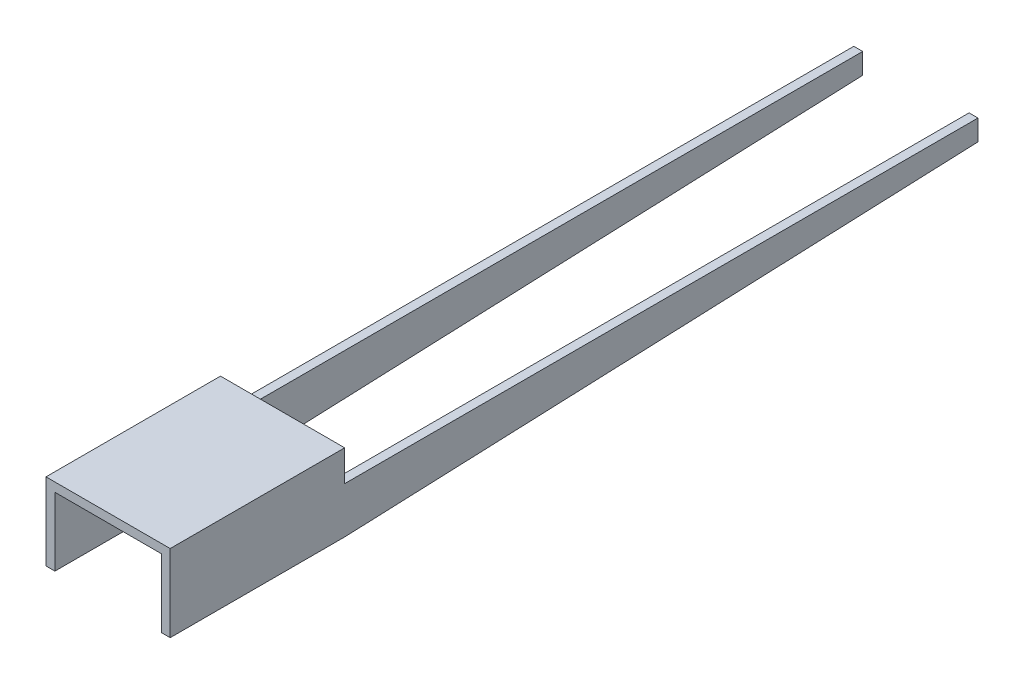
ISO-10303-21;
HEADER;
FILE_DESCRIPTION(('STEP AP214'),'2;1');
FILE_NAME('part.step','',(''),(''),'','','');
FILE_SCHEMA(('AUTOMOTIVE_DESIGN { 1 0 10303 214 1 1 1 1 }'));
ENDSEC;
DATA;
#1=APPLICATION_CONTEXT('core data for automotive mechanical design processes');
#2=APPLICATION_PROTOCOL_DEFINITION('international standard','automotive_design',2000,#1);
#3=PRODUCT_CONTEXT('',#1,'mechanical');
#4=PRODUCT('Part','Part','',(#3));
#5=PRODUCT_RELATED_PRODUCT_CATEGORY('part','',(#4));
#6=PRODUCT_DEFINITION_FORMATION('','',#4);
#7=PRODUCT_DEFINITION_CONTEXT('part definition',#1,'design');
#8=PRODUCT_DEFINITION('design','',#6,#7);
#9=PRODUCT_DEFINITION_SHAPE('','',#8);
#10=(LENGTH_UNIT() NAMED_UNIT(*) SI_UNIT(.MILLI.,.METRE.));
#11=(NAMED_UNIT(*) PLANE_ANGLE_UNIT() SI_UNIT($,.RADIAN.));
#12=(NAMED_UNIT(*) SI_UNIT($,.STERADIAN.) SOLID_ANGLE_UNIT());
#13=UNCERTAINTY_MEASURE_WITH_UNIT(LENGTH_MEASURE(1.E-05),#10,'distance_accuracy_value','');
#14=(GEOMETRIC_REPRESENTATION_CONTEXT(3) GLOBAL_UNCERTAINTY_ASSIGNED_CONTEXT((#13)) GLOBAL_UNIT_ASSIGNED_CONTEXT((#10,
#11,#12)) REPRESENTATION_CONTEXT('',''));
#15=CARTESIAN_POINT('',(0.,0.,0.));
#16=DIRECTION('',(0.,0.,1.));
#17=DIRECTION('',(1.,0.,0.));
#18=AXIS2_PLACEMENT_3D('',#15,#16,#17);
#19=CARTESIAN_POINT('',(0.,0.,0.));
#20=DIRECTION('',(0.,0.,1.));
#21=DIRECTION('',(1.,0.,0.));
#22=AXIS2_PLACEMENT_3D('',#19,#20,#21);
#23=PLANE('',#22);
#24=DIRECTION('',(-1.,0.,0.));
#25=VECTOR('',#24,1.);
#26=CARTESIAN_POINT('',(0.,10.,0.));
#27=LINE('',#26,#25);
#28=CARTESIAN_POINT('',(-25.7,10.,0.));
#29=VERTEX_POINT('',#28);
#30=CARTESIAN_POINT('',(-30.,10.,0.));
#31=VERTEX_POINT('',#30);
#32=EDGE_CURVE('E268',#29,#31,#27,.T.);
#33=ORIENTED_EDGE('',*,*,#32,.F.);
#34=DIRECTION('',(0.,1.,0.));
#35=VECTOR('',#34,1.);
#36=CARTESIAN_POINT('',(-25.7,0.,0.));
#37=LINE('',#36,#35);
#38=CARTESIAN_POINT('',(-25.7,0.,0.));
#39=VERTEX_POINT('',#38);
#40=EDGE_CURVE('E251',#39,#29,#37,.T.);
#41=ORIENTED_EDGE('',*,*,#40,.F.);
#42=DIRECTION('',(1.,0.,0.));
#43=VECTOR('',#42,1.);
#44=CARTESIAN_POINT('',(-30.,0.,0.));
#45=LINE('',#44,#43);
#46=CARTESIAN_POINT('',(-30.,0.,0.));
#47=VERTEX_POINT('',#46);
#48=EDGE_CURVE('E248',#47,#39,#45,.T.);
#49=ORIENTED_EDGE('',*,*,#48,.F.);
#50=DIRECTION('',(0.,-1.,0.));
#51=VECTOR('',#50,1.);
#52=CARTESIAN_POINT('',(-30.,25.,0.));
#53=LINE('',#52,#51);
#54=EDGE_CURVE('E239',#31,#47,#53,.T.);
#55=ORIENTED_EDGE('',*,*,#54,.F.);
#56=EDGE_LOOP('',(#33,#41,#49,#55));
#57=FACE_BOUND('',#56,.T.);
#58=ADVANCED_FACE('F43',(#57),#23,.F.);
#59=DIRECTION('',(-1.,0.,0.));
#60=VECTOR('',#59,1.);
#61=CARTESIAN_POINT('',(0.,10.,0.));
#62=LINE('',#61,#60);
#63=CARTESIAN_POINT('',(30.,10.,0.));
#64=VERTEX_POINT('',#63);
#65=CARTESIAN_POINT('',(25.7,10.,0.));
#66=VERTEX_POINT('',#65);
#67=EDGE_CURVE('E11',#64,#66,#62,.T.);
#68=ORIENTED_EDGE('',*,*,#67,.F.);
#69=DIRECTION('',(0.,1.,0.));
#70=VECTOR('',#69,1.);
#71=CARTESIAN_POINT('',(30.,0.,0.));
#72=LINE('',#71,#70);
#73=CARTESIAN_POINT('',(30.,0.,0.));
#74=VERTEX_POINT('',#73);
#75=EDGE_CURVE('E183',#74,#64,#72,.T.);
#76=ORIENTED_EDGE('',*,*,#75,.F.);
#77=DIRECTION('',(1.,0.,0.));
#78=VECTOR('',#77,1.);
#79=CARTESIAN_POINT('',(25.7,0.,0.));
#80=LINE('',#79,#78);
#81=CARTESIAN_POINT('',(25.7,0.,0.));
#82=VERTEX_POINT('',#81);
#83=EDGE_CURVE('E253',#82,#74,#80,.T.);
#84=ORIENTED_EDGE('',*,*,#83,.F.);
#85=DIRECTION('',(0.,-1.,0.));
#86=VECTOR('',#85,1.);
#87=CARTESIAN_POINT('',(25.7,20.7,0.));
#88=LINE('',#87,#86);
#89=EDGE_CURVE('E82',#66,#82,#88,.T.);
#90=ORIENTED_EDGE('',*,*,#89,.F.);
#91=EDGE_LOOP('',(#68,#76,#84,#90));
#92=FACE_BOUND('',#91,.T.);
#93=ADVANCED_FACE('F261',(#92),#23,.F.);
#94=CARTESIAN_POINT('',(-30.,25.,390.3));
#95=DIRECTION('',(1.,0.,0.));
#96=DIRECTION('',(0.,0.,-1.));
#97=AXIS2_PLACEMENT_3D('',#94,#95,#96);
#98=PLANE('',#97);
#99=DIRECTION('',(0.,0.,-1.));
#100=VECTOR('',#99,1.);
#101=CARTESIAN_POINT('',(-30.,25.,390.3));
#102=LINE('',#101,#100);
#103=CARTESIAN_POINT('',(-30.,25.,390.3));
#104=VERTEX_POINT('',#103);
#105=CARTESIAN_POINT('',(-30.,25.,306.));
#106=VERTEX_POINT('',#105);
#107=EDGE_CURVE('E169',#104,#106,#102,.T.);
#108=ORIENTED_EDGE('',*,*,#107,.T.);
#109=DIRECTION('',(0.,-1.,0.));
#110=VECTOR('',#109,1.);
#111=CARTESIAN_POINT('',(-30.,25.,306.));
#112=LINE('',#111,#110);
#113=CARTESIAN_POINT('',(-30.,10.,306.));
#114=VERTEX_POINT('',#113);
#115=EDGE_CURVE('E153',#106,#114,#112,.T.);
#116=ORIENTED_EDGE('',*,*,#115,.T.);
#117=DIRECTION('',(0.,0.,1.));
#118=VECTOR('',#117,1.);
#119=CARTESIAN_POINT('',(-30.,10.,390.3));
#120=LINE('',#119,#118);
#121=EDGE_CURVE('E273',#31,#114,#120,.T.);
#122=ORIENTED_EDGE('',*,*,#121,.F.);
#123=ORIENTED_EDGE('',*,*,#54,.T.);
#124=DIRECTION('',(0.,0.040196245461984,-0.999191804335264));
#125=VECTOR('',#124,1.);
#126=CARTESIAN_POINT('',(-30.,-12.31,306.));
#127=LINE('',#126,#125);
#128=CARTESIAN_POINT('',(-30.,-12.31,306.));
#129=VERTEX_POINT('',#128);
#130=EDGE_CURVE('E210',#129,#47,#127,.T.);
#131=ORIENTED_EDGE('',*,*,#130,.F.);
#132=DIRECTION('',(0.,0.,-1.));
#133=VECTOR('',#132,1.);
#134=CARTESIAN_POINT('',(-30.,-12.31,390.3));
#135=LINE('',#134,#133);
#136=CARTESIAN_POINT('',(-30.,-12.31,390.3));
#137=VERTEX_POINT('',#136);
#138=EDGE_CURVE('E163',#137,#129,#135,.T.);
#139=ORIENTED_EDGE('',*,*,#138,.F.);
#140=DIRECTION('',(0.,-1.,0.));
#141=VECTOR('',#140,1.);
#142=CARTESIAN_POINT('',(-30.,25.,390.3));
#143=LINE('',#142,#141);
#144=EDGE_CURVE('E176',#104,#137,#143,.T.);
#145=ORIENTED_EDGE('',*,*,#144,.F.);
#146=EDGE_LOOP('',(#108,#116,#122,#123,#131,#139,#145));
#147=FACE_BOUND('',#146,.T.);
#148=ADVANCED_FACE('F45',(#147),#98,.F.);
#149=CARTESIAN_POINT('',(-25.7,0.,390.3));
#150=DIRECTION('',(-1.,0.,0.));
#151=DIRECTION('',(0.,0.,1.));
#152=AXIS2_PLACEMENT_3D('',#149,#150,#151);
#153=PLANE('',#152);
#154=DIRECTION('',(0.,0.,-1.));
#155=VECTOR('',#154,1.);
#156=CARTESIAN_POINT('',(-25.7,10.,390.3));
#157=LINE('',#156,#155);
#158=CARTESIAN_POINT('',(-25.7,10.,306.));
#159=VERTEX_POINT('',#158);
#160=EDGE_CURVE('E201',#159,#29,#157,.T.);
#161=ORIENTED_EDGE('',*,*,#160,.F.);
#162=DIRECTION('',(0.,1.,0.));
#163=VECTOR('',#162,1.);
#164=CARTESIAN_POINT('',(-25.7,0.,306.));
#165=LINE('',#164,#163);
#166=CARTESIAN_POINT('',(-25.7,20.7,306.));
#167=VERTEX_POINT('',#166);
#168=EDGE_CURVE('E164',#159,#167,#165,.T.);
#169=ORIENTED_EDGE('',*,*,#168,.T.);
#170=DIRECTION('',(0.,0.,-1.));
#171=VECTOR('',#170,1.);
#172=CARTESIAN_POINT('',(-25.7,20.7,390.3));
#173=LINE('',#172,#171);
#174=CARTESIAN_POINT('',(-25.7,20.7,390.3));
#175=VERTEX_POINT('',#174);
#176=EDGE_CURVE('E51',#175,#167,#173,.T.);
#177=ORIENTED_EDGE('',*,*,#176,.F.);
#178=DIRECTION('',(0.,1.,0.));
#179=VECTOR('',#178,1.);
#180=CARTESIAN_POINT('',(-25.7,0.,390.3));
#181=LINE('',#180,#179);
#182=CARTESIAN_POINT('',(-25.7,-12.31,390.3));
#183=VERTEX_POINT('',#182);
#184=EDGE_CURVE('E89',#183,#175,#181,.T.);
#185=ORIENTED_EDGE('',*,*,#184,.F.);
#186=DIRECTION('',(0.,0.,-1.));
#187=VECTOR('',#186,1.);
#188=CARTESIAN_POINT('',(-25.7,-12.31,390.3));
#189=LINE('',#188,#187);
#190=CARTESIAN_POINT('',(-25.7,-12.31,306.));
#191=VERTEX_POINT('',#190);
#192=EDGE_CURVE('E207',#183,#191,#189,.T.);
#193=ORIENTED_EDGE('',*,*,#192,.T.);
#194=DIRECTION('',(0.,0.040196245461984,-0.999191804335264));
#195=VECTOR('',#194,1.);
#196=CARTESIAN_POINT('',(-25.7,-12.31,306.));
#197=LINE('',#196,#195);
#198=EDGE_CURVE('E209',#191,#39,#197,.T.);
#199=ORIENTED_EDGE('',*,*,#198,.T.);
#200=ORIENTED_EDGE('',*,*,#40,.T.);
#201=EDGE_LOOP('',(#161,#169,#177,#185,#193,#199,#200));
#202=FACE_BOUND('',#201,.T.);
#203=ADVANCED_FACE('F198',(#202),#153,.F.);
#204=CARTESIAN_POINT('',(-25.7,20.7,390.3));
#205=DIRECTION('',(0.,1.,0.));
#206=DIRECTION('',(0.,0.,1.));
#207=AXIS2_PLACEMENT_3D('',#204,#205,#206);
#208=PLANE('',#207);
#209=ORIENTED_EDGE('',*,*,#176,.T.);
#210=DIRECTION('',(1.,0.,0.));
#211=VECTOR('',#210,1.);
#212=CARTESIAN_POINT('',(-25.7,20.7,306.));
#213=LINE('',#212,#211);
#214=CARTESIAN_POINT('',(25.7,20.7,306.));
#215=VERTEX_POINT('',#214);
#216=EDGE_CURVE('E193',#167,#215,#213,.T.);
#217=ORIENTED_EDGE('',*,*,#216,.T.);
#218=DIRECTION('',(0.,0.,-1.));
#219=VECTOR('',#218,1.);
#220=CARTESIAN_POINT('',(25.7,20.7,390.3));
#221=LINE('',#220,#219);
#222=CARTESIAN_POINT('',(25.7,20.7,390.3));
#223=VERTEX_POINT('',#222);
#224=EDGE_CURVE('E178',#223,#215,#221,.T.);
#225=ORIENTED_EDGE('',*,*,#224,.F.);
#226=DIRECTION('',(1.,0.,0.));
#227=VECTOR('',#226,1.);
#228=CARTESIAN_POINT('',(-25.7,20.7,390.3));
#229=LINE('',#228,#227);
#230=EDGE_CURVE('E194',#175,#223,#229,.T.);
#231=ORIENTED_EDGE('',*,*,#230,.F.);
#232=EDGE_LOOP('',(#209,#217,#225,#231));
#233=FACE_BOUND('',#232,.T.);
#234=ADVANCED_FACE('F191',(#233),#208,.F.);
#235=CARTESIAN_POINT('',(25.7,20.7,390.3));
#236=DIRECTION('',(1.,0.,0.));
#237=DIRECTION('',(0.,0.,-1.));
#238=AXIS2_PLACEMENT_3D('',#235,#236,#237);
#239=PLANE('',#238);
#240=ORIENTED_EDGE('',*,*,#224,.T.);
#241=DIRECTION('',(0.,-1.,0.));
#242=VECTOR('',#241,1.);
#243=CARTESIAN_POINT('',(25.7,20.7,306.));
#244=LINE('',#243,#242);
#245=CARTESIAN_POINT('',(25.7,10.,306.));
#246=VERTEX_POINT('',#245);
#247=EDGE_CURVE('E203',#215,#246,#244,.T.);
#248=ORIENTED_EDGE('',*,*,#247,.T.);
#249=DIRECTION('',(0.,0.,1.));
#250=VECTOR('',#249,1.);
#251=CARTESIAN_POINT('',(25.7,10.,390.3));
#252=LINE('',#251,#250);
#253=EDGE_CURVE('E263',#66,#246,#252,.T.);
#254=ORIENTED_EDGE('',*,*,#253,.F.);
#255=ORIENTED_EDGE('',*,*,#89,.T.);
#256=DIRECTION('',(0.,0.040196245461984,-0.999191804335264));
#257=VECTOR('',#256,1.);
#258=CARTESIAN_POINT('',(25.7,-12.31,306.));
#259=LINE('',#258,#257);
#260=CARTESIAN_POINT('',(25.7,-12.31,306.));
#261=VERTEX_POINT('',#260);
#262=EDGE_CURVE('E227',#261,#82,#259,.T.);
#263=ORIENTED_EDGE('',*,*,#262,.F.);
#264=DIRECTION('',(0.,0.,-1.));
#265=VECTOR('',#264,1.);
#266=CARTESIAN_POINT('',(25.7,-12.31,390.3));
#267=LINE('',#266,#265);
#268=CARTESIAN_POINT('',(25.7,-12.31,390.3));
#269=VERTEX_POINT('',#268);
#270=EDGE_CURVE('E224',#269,#261,#267,.T.);
#271=ORIENTED_EDGE('',*,*,#270,.F.);
#272=DIRECTION('',(0.,-1.,0.));
#273=VECTOR('',#272,1.);
#274=CARTESIAN_POINT('',(25.7,20.7,390.3));
#275=LINE('',#274,#273);
#276=EDGE_CURVE('E244',#223,#269,#275,.T.);
#277=ORIENTED_EDGE('',*,*,#276,.F.);
#278=EDGE_LOOP('',(#240,#248,#254,#255,#263,#271,#277));
#279=FACE_BOUND('',#278,.T.);
#280=ADVANCED_FACE('F266',(#279),#239,.F.);
#281=CARTESIAN_POINT('',(30.,0.,390.3));
#282=DIRECTION('',(-1.,0.,0.));
#283=DIRECTION('',(0.,0.,1.));
#284=AXIS2_PLACEMENT_3D('',#281,#282,#283);
#285=PLANE('',#284);
#286=DIRECTION('',(0.,0.,-1.));
#287=VECTOR('',#286,1.);
#288=CARTESIAN_POINT('',(30.,10.,390.3));
#289=LINE('',#288,#287);
#290=CARTESIAN_POINT('',(30.,10.,306.));
#291=VERTEX_POINT('',#290);
#292=EDGE_CURVE('E57',#291,#64,#289,.T.);
#293=ORIENTED_EDGE('',*,*,#292,.F.);
#294=DIRECTION('',(0.,1.,0.));
#295=VECTOR('',#294,1.);
#296=CARTESIAN_POINT('',(30.,0.,306.));
#297=LINE('',#296,#295);
#298=CARTESIAN_POINT('',(30.,25.,306.));
#299=VERTEX_POINT('',#298);
#300=EDGE_CURVE('E275',#291,#299,#297,.T.);
#301=ORIENTED_EDGE('',*,*,#300,.T.);
#302=DIRECTION('',(0.,0.,-1.));
#303=VECTOR('',#302,1.);
#304=CARTESIAN_POINT('',(30.,25.,390.3));
#305=LINE('',#304,#303);
#306=CARTESIAN_POINT('',(30.,25.,390.3));
#307=VERTEX_POINT('',#306);
#308=EDGE_CURVE('E172',#307,#299,#305,.T.);
#309=ORIENTED_EDGE('',*,*,#308,.F.);
#310=DIRECTION('',(0.,1.,0.));
#311=VECTOR('',#310,1.);
#312=CARTESIAN_POINT('',(30.,0.,390.3));
#313=LINE('',#312,#311);
#314=CARTESIAN_POINT('',(30.,-12.31,390.3));
#315=VERTEX_POINT('',#314);
#316=EDGE_CURVE('E180',#315,#307,#313,.T.);
#317=ORIENTED_EDGE('',*,*,#316,.F.);
#318=DIRECTION('',(0.,0.,-1.));
#319=VECTOR('',#318,1.);
#320=CARTESIAN_POINT('',(30.,-12.31,390.3));
#321=LINE('',#320,#319);
#322=CARTESIAN_POINT('',(30.,-12.31,306.));
#323=VERTEX_POINT('',#322);
#324=EDGE_CURVE('E221',#315,#323,#321,.T.);
#325=ORIENTED_EDGE('',*,*,#324,.T.);
#326=DIRECTION('',(0.,0.040196245461984,-0.999191804335264));
#327=VECTOR('',#326,1.);
#328=CARTESIAN_POINT('',(30.,-12.31,306.));
#329=LINE('',#328,#327);
#330=EDGE_CURVE('E228',#323,#74,#329,.T.);
#331=ORIENTED_EDGE('',*,*,#330,.T.);
#332=ORIENTED_EDGE('',*,*,#75,.T.);
#333=EDGE_LOOP('',(#293,#301,#309,#317,#325,#331,#332));
#334=FACE_BOUND('',#333,.T.);
#335=ADVANCED_FACE('F259',(#334),#285,.F.);
#336=CARTESIAN_POINT('',(30.,25.,390.3));
#337=DIRECTION('',(0.,-1.,0.));
#338=DIRECTION('',(0.,0.,-1.));
#339=AXIS2_PLACEMENT_3D('',#336,#337,#338);
#340=PLANE('',#339);
#341=ORIENTED_EDGE('',*,*,#308,.T.);
#342=DIRECTION('',(1.,0.,0.));
#343=VECTOR('',#342,1.);
#344=CARTESIAN_POINT('',(-72.4088878130035,25.,306.));
#345=LINE('',#344,#343);
#346=EDGE_CURVE('E156',#106,#299,#345,.T.);
#347=ORIENTED_EDGE('',*,*,#346,.F.);
#348=ORIENTED_EDGE('',*,*,#107,.F.);
#349=DIRECTION('',(-1.,0.,0.));
#350=VECTOR('',#349,1.);
#351=CARTESIAN_POINT('',(30.,25.,390.3));
#352=LINE('',#351,#350);
#353=EDGE_CURVE('E66',#307,#104,#352,.T.);
#354=ORIENTED_EDGE('',*,*,#353,.F.);
#355=EDGE_LOOP('',(#341,#347,#348,#354));
#356=FACE_BOUND('',#355,.T.);
#357=ADVANCED_FACE('F168',(#356),#340,.F.);
#358=CARTESIAN_POINT('',(0.,0.,390.3));
#359=DIRECTION('',(0.,0.,1.));
#360=DIRECTION('',(1.,0.,0.));
#361=AXIS2_PLACEMENT_3D('',#358,#359,#360);
#362=PLANE('',#361);
#363=ORIENTED_EDGE('',*,*,#144,.T.);
#364=DIRECTION('',(-1.,0.,0.));
#365=VECTOR('',#364,1.);
#366=CARTESIAN_POINT('',(-25.7,-12.31,390.3));
#367=LINE('',#366,#365);
#368=EDGE_CURVE('E213',#183,#137,#367,.T.);
#369=ORIENTED_EDGE('',*,*,#368,.F.);
#370=ORIENTED_EDGE('',*,*,#184,.T.);
#371=ORIENTED_EDGE('',*,*,#230,.T.);
#372=ORIENTED_EDGE('',*,*,#276,.T.);
#373=DIRECTION('',(1.,0.,0.));
#374=VECTOR('',#373,1.);
#375=CARTESIAN_POINT('',(25.7,-12.31,390.3));
#376=LINE('',#375,#374);
#377=EDGE_CURVE('E236',#269,#315,#376,.T.);
#378=ORIENTED_EDGE('',*,*,#377,.T.);
#379=ORIENTED_EDGE('',*,*,#316,.T.);
#380=ORIENTED_EDGE('',*,*,#353,.T.);
#381=EDGE_LOOP('',(#363,#369,#370,#371,#372,#378,#379,#380));
#382=FACE_BOUND('',#381,.T.);
#383=ADVANCED_FACE('F289',(#382),#362,.T.);
#384=CARTESIAN_POINT('',(25.7,-12.31,390.3));
#385=DIRECTION('',(0.,-1.,0.));
#386=DIRECTION('',(1.,0.,0.));
#387=AXIS2_PLACEMENT_3D('',#384,#385,#386);
#388=PLANE('',#387);
#389=ORIENTED_EDGE('',*,*,#324,.F.);
#390=ORIENTED_EDGE('',*,*,#377,.F.);
#391=ORIENTED_EDGE('',*,*,#270,.T.);
#392=DIRECTION('',(1.,0.,0.));
#393=VECTOR('',#392,1.);
#394=CARTESIAN_POINT('',(25.7,-12.31,306.));
#395=LINE('',#394,#393);
#396=EDGE_CURVE('E231',#261,#323,#395,.T.);
#397=ORIENTED_EDGE('',*,*,#396,.T.);
#398=EDGE_LOOP('',(#389,#390,#391,#397));
#399=FACE_BOUND('',#398,.T.);
#400=ADVANCED_FACE('F291',(#399),#388,.T.);
#401=CARTESIAN_POINT('',(25.7,-12.31,306.));
#402=DIRECTION('',(0.,-0.999191804335264,-0.040196245461984));
#403=DIRECTION('',(0.,0.040196245461984,-0.999191804335264));
#404=AXIS2_PLACEMENT_3D('',#401,#402,#403);
#405=PLANE('',#404);
#406=ORIENTED_EDGE('',*,*,#330,.F.);
#407=ORIENTED_EDGE('',*,*,#396,.F.);
#408=ORIENTED_EDGE('',*,*,#262,.T.);
#409=ORIENTED_EDGE('',*,*,#83,.T.);
#410=EDGE_LOOP('',(#406,#407,#408,#409));
#411=FACE_BOUND('',#410,.T.);
#412=ADVANCED_FACE('F297',(#411),#405,.T.);
#413=CARTESIAN_POINT('',(-25.7,-12.31,390.3));
#414=DIRECTION('',(0.,1.,0.));
#415=DIRECTION('',(-1.,0.,0.));
#416=AXIS2_PLACEMENT_3D('',#413,#414,#415);
#417=PLANE('',#416);
#418=ORIENTED_EDGE('',*,*,#138,.T.);
#419=DIRECTION('',(-1.,0.,0.));
#420=VECTOR('',#419,1.);
#421=CARTESIAN_POINT('',(-25.7,-12.31,306.));
#422=LINE('',#421,#420);
#423=EDGE_CURVE('E218',#191,#129,#422,.T.);
#424=ORIENTED_EDGE('',*,*,#423,.F.);
#425=ORIENTED_EDGE('',*,*,#192,.F.);
#426=ORIENTED_EDGE('',*,*,#368,.T.);
#427=EDGE_LOOP('',(#418,#424,#425,#426));
#428=FACE_BOUND('',#427,.T.);
#429=ADVANCED_FACE('F287',(#428),#417,.F.);
#430=CARTESIAN_POINT('',(-25.7,-12.31,306.));
#431=DIRECTION('',(0.,0.999191804335264,0.040196245461984));
#432=DIRECTION('',(0.,-0.040196245461984,0.999191804335264));
#433=AXIS2_PLACEMENT_3D('',#430,#431,#432);
#434=PLANE('',#433);
#435=ORIENTED_EDGE('',*,*,#130,.T.);
#436=ORIENTED_EDGE('',*,*,#48,.T.);
#437=ORIENTED_EDGE('',*,*,#198,.F.);
#438=ORIENTED_EDGE('',*,*,#423,.T.);
#439=EDGE_LOOP('',(#435,#436,#437,#438));
#440=FACE_BOUND('',#439,.T.);
#441=ADVANCED_FACE('F284',(#440),#434,.F.);
#442=CARTESIAN_POINT('',(-72.4088878130035,10.,306.));
#443=DIRECTION('',(0.,0.,1.));
#444=DIRECTION('',(1.,0.,0.));
#445=AXIS2_PLACEMENT_3D('',#442,#443,#444);
#446=PLANE('',#445);
#447=ORIENTED_EDGE('',*,*,#346,.T.);
#448=ORIENTED_EDGE('',*,*,#300,.F.);
#449=DIRECTION('',(1.,0.,0.));
#450=VECTOR('',#449,1.);
#451=CARTESIAN_POINT('',(-72.4088878130035,10.,306.));
#452=LINE('',#451,#450);
#453=EDGE_CURVE('E173',#246,#291,#452,.T.);
#454=ORIENTED_EDGE('',*,*,#453,.F.);
#455=ORIENTED_EDGE('',*,*,#247,.F.);
#456=ORIENTED_EDGE('',*,*,#216,.F.);
#457=ORIENTED_EDGE('',*,*,#168,.F.);
#458=EDGE_CURVE('E159',#114,#159,#452,.T.);
#459=ORIENTED_EDGE('',*,*,#458,.F.);
#460=ORIENTED_EDGE('',*,*,#115,.F.);
#461=EDGE_LOOP('',(#447,#448,#454,#455,#456,#457,#459,#460));
#462=FACE_BOUND('',#461,.T.);
#463=ADVANCED_FACE('F155',(#462),#446,.F.);
#464=CARTESIAN_POINT('',(0.,10.,0.));
#465=DIRECTION('',(0.,1.,0.));
#466=DIRECTION('',(0.,0.,1.));
#467=AXIS2_PLACEMENT_3D('',#464,#465,#466);
#468=PLANE('',#467);
#469=ORIENTED_EDGE('',*,*,#121,.T.);
#470=ORIENTED_EDGE('',*,*,#458,.T.);
#471=ORIENTED_EDGE('',*,*,#160,.T.);
#472=ORIENTED_EDGE('',*,*,#32,.T.);
#473=EDGE_LOOP('',(#469,#470,#471,#472));
#474=FACE_BOUND('',#473,.T.);
#475=ADVANCED_FACE('F278',(#474),#468,.T.);
#476=ORIENTED_EDGE('',*,*,#253,.T.);
#477=ORIENTED_EDGE('',*,*,#453,.T.);
#478=ORIENTED_EDGE('',*,*,#292,.T.);
#479=ORIENTED_EDGE('',*,*,#67,.T.);
#480=EDGE_LOOP('',(#476,#477,#478,#479));
#481=FACE_BOUND('',#480,.T.);
#482=ADVANCED_FACE('F262',(#481),#468,.T.);
#483=CLOSED_SHELL('',(#58,#93,#148,#203,#234,#280,#335,#357,#383,#400,#412,#429,#441,#463,#475,#482));
#484=MANIFOLD_SOLID_BREP('B2',#483);
#485=ADVANCED_BREP_SHAPE_REPRESENTATION('',(#18,#484),#14);
#486=SHAPE_DEFINITION_REPRESENTATION(#9,#485);
ENDSEC;
END-ISO-10303-21;
